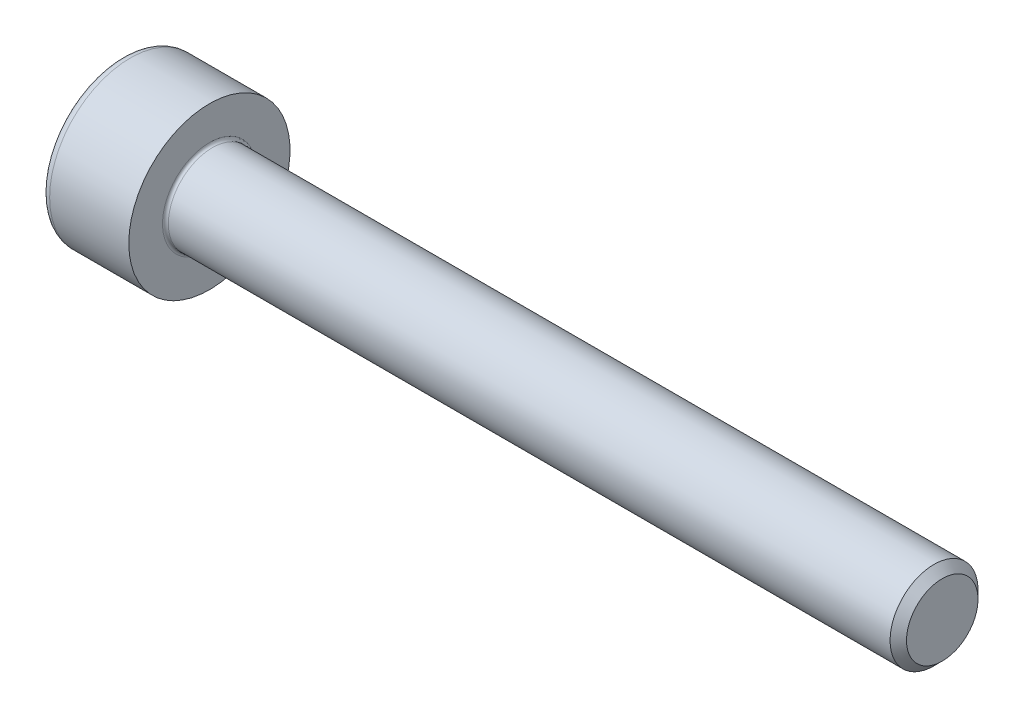
ISO-10303-21;
HEADER;
FILE_DESCRIPTION(('STEP AP214'),'2;1');
FILE_NAME('part.step','',(''),(''),'','','');
FILE_SCHEMA(('AUTOMOTIVE_DESIGN { 1 0 10303 214 1 1 1 1 }'));
ENDSEC;
DATA;
#1=APPLICATION_CONTEXT('core data for automotive mechanical design processes');
#2=APPLICATION_PROTOCOL_DEFINITION('international standard','automotive_design',2000,#1);
#3=PRODUCT_CONTEXT('',#1,'mechanical');
#4=PRODUCT('Part','Part','',(#3));
#5=PRODUCT_RELATED_PRODUCT_CATEGORY('part','',(#4));
#6=PRODUCT_DEFINITION_FORMATION('','',#4);
#7=PRODUCT_DEFINITION_CONTEXT('part definition',#1,'design');
#8=PRODUCT_DEFINITION('design','',#6,#7);
#9=PRODUCT_DEFINITION_SHAPE('','',#8);
#10=(LENGTH_UNIT() NAMED_UNIT(*) SI_UNIT(.MILLI.,.METRE.));
#11=(NAMED_UNIT(*) PLANE_ANGLE_UNIT() SI_UNIT($,.RADIAN.));
#12=(NAMED_UNIT(*) SI_UNIT($,.STERADIAN.) SOLID_ANGLE_UNIT());
#13=UNCERTAINTY_MEASURE_WITH_UNIT(LENGTH_MEASURE(1.E-05),#10,'distance_accuracy_value','');
#14=(GEOMETRIC_REPRESENTATION_CONTEXT(3) GLOBAL_UNCERTAINTY_ASSIGNED_CONTEXT((#13)) GLOBAL_UNIT_ASSIGNED_CONTEXT((#10,
#11,#12)) REPRESENTATION_CONTEXT('',''));
#15=CARTESIAN_POINT('',(0.,0.,0.));
#16=DIRECTION('',(0.,0.,1.));
#17=DIRECTION('',(1.,0.,0.));
#18=AXIS2_PLACEMENT_3D('',#15,#16,#17);
#19=CARTESIAN_POINT('',(0.,0.,0.));
#20=DIRECTION('',(-1.,0.,0.));
#21=DIRECTION('',(0.,0.,1.));
#22=AXIS2_PLACEMENT_3D('',#19,#20,#21);
#23=PLANE('',#22);
#24=DIRECTION('',(0.,-0.499999999999999,0.866025403784439));
#25=VECTOR('',#24,1.);
#26=CARTESIAN_POINT('',(0.,1.45492267835786,0.));
#27=LINE('',#26,#25);
#28=CARTESIAN_POINT('',(0.,1.45492267835786,0.));
#29=VERTEX_POINT('',#28);
#30=CARTESIAN_POINT('',(0.,0.72746133917893,1.26));
#31=VERTEX_POINT('',#30);
#32=EDGE_CURVE('E259',#29,#31,#27,.T.);
#33=ORIENTED_EDGE('',*,*,#32,.T.);
#34=DIRECTION('',(0.,1.,0.));
#35=VECTOR('',#34,1.);
#36=CARTESIAN_POINT('',(0.,-0.727461339178927,1.26));
#37=LINE('',#36,#35);
#38=CARTESIAN_POINT('',(0.,-0.727461339178927,1.26));
#39=VERTEX_POINT('',#38);
#40=EDGE_CURVE('E131',#39,#31,#37,.T.);
#41=ORIENTED_EDGE('',*,*,#40,.F.);
#42=DIRECTION('',(0.,-0.500000000000001,-0.866025403784438));
#43=VECTOR('',#42,1.);
#44=CARTESIAN_POINT('',(0.,-0.727461339178927,1.26));
#45=LINE('',#44,#43);
#46=CARTESIAN_POINT('',(0.,-1.45492267835786,0.));
#47=VERTEX_POINT('',#46);
#48=EDGE_CURVE('E262',#39,#47,#45,.T.);
#49=ORIENTED_EDGE('',*,*,#48,.T.);
#50=DIRECTION('',(0.,0.499999999999999,-0.866025403784439));
#51=VECTOR('',#50,1.);
#52=CARTESIAN_POINT('',(0.,-1.45492267835786,0.));
#53=LINE('',#52,#51);
#54=CARTESIAN_POINT('',(0.,-0.727461339178931,-1.26));
#55=VERTEX_POINT('',#54);
#56=EDGE_CURVE('E265',#47,#55,#53,.T.);
#57=ORIENTED_EDGE('',*,*,#56,.T.);
#58=DIRECTION('',(0.,-1.,0.));
#59=VECTOR('',#58,1.);
#60=CARTESIAN_POINT('',(0.,0.727461339178927,-1.26));
#61=LINE('',#60,#59);
#62=CARTESIAN_POINT('',(0.,0.727461339178927,-1.26));
#63=VERTEX_POINT('',#62);
#64=EDGE_CURVE('E268',#63,#55,#61,.T.);
#65=ORIENTED_EDGE('',*,*,#64,.F.);
#66=DIRECTION('',(0.,-0.500000000000001,-0.866025403784438));
#67=VECTOR('',#66,1.);
#68=CARTESIAN_POINT('',(0.,1.45492267835786,0.));
#69=LINE('',#68,#67);
#70=EDGE_CURVE('E126',#29,#63,#69,.T.);
#71=ORIENTED_EDGE('',*,*,#70,.F.);
#72=EDGE_LOOP('',(#33,#41,#49,#57,#65,#71));
#73=FACE_BOUND('',#72,.T.);
#74=CARTESIAN_POINT('',(0.,0.,0.));
#75=DIRECTION('',(-1.,0.,0.));
#76=DIRECTION('',(0.,0.,1.));
#77=AXIS2_PLACEMENT_3D('',#74,#75,#76);
#78=CIRCLE('',#77,2.45);
#79=CARTESIAN_POINT('',(0.,0.,2.45));
#80=VERTEX_POINT('',#79);
#81=EDGE_CURVE('E43',#80,#80,#78,.T.);
#82=ORIENTED_EDGE('',*,*,#81,.T.);
#83=EDGE_LOOP('',(#82));
#84=FACE_BOUND('',#83,.T.);
#85=ADVANCED_FACE('F35',(#73,#84),#23,.T.);
#86=CARTESIAN_POINT('',(-31.75,0.,0.));
#87=DIRECTION('',(-1.,0.,0.));
#88=DIRECTION('',(0.,0.,1.));
#89=AXIS2_PLACEMENT_3D('',#86,#87,#88);
#90=CYLINDRICAL_SURFACE('',#89,2.75);
#91=CARTESIAN_POINT('',(0.300000000000002,0.,0.));
#92=DIRECTION('',(-1.,0.,0.));
#93=DIRECTION('',(0.,0.,1.));
#94=AXIS2_PLACEMENT_3D('',#91,#92,#93);
#95=CIRCLE('',#94,2.75);
#96=CARTESIAN_POINT('',(0.300000000000002,0.,2.75));
#97=VERTEX_POINT('',#96);
#98=EDGE_CURVE('E11',#97,#97,#95,.F.);
#99=ORIENTED_EDGE('',*,*,#98,.T.);
#100=EDGE_LOOP('',(#99));
#101=FACE_BOUND('',#100,.T.);
#102=CARTESIAN_POINT('',(3.,0.,0.));
#103=DIRECTION('',(-1.,0.,0.));
#104=DIRECTION('',(0.,0.,1.));
#105=AXIS2_PLACEMENT_3D('',#102,#103,#104);
#106=CIRCLE('',#105,2.75);
#107=CARTESIAN_POINT('',(3.,0.,2.75));
#108=VERTEX_POINT('',#107);
#109=EDGE_CURVE('E149',#108,#108,#106,.T.);
#110=ORIENTED_EDGE('',*,*,#109,.T.);
#111=EDGE_LOOP('',(#110));
#112=FACE_BOUND('',#111,.T.);
#113=ADVANCED_FACE('F173',(#101,#112),#90,.T.);
#114=CARTESIAN_POINT('',(3.,2.75,0.));
#115=DIRECTION('',(1.,0.,0.));
#116=DIRECTION('',(0.,0.,-1.));
#117=AXIS2_PLACEMENT_3D('',#114,#115,#116);
#118=PLANE('',#117);
#119=CARTESIAN_POINT('',(3.,0.,0.));
#120=DIRECTION('',(1.,0.,0.));
#121=DIRECTION('',(0.,0.,-1.));
#122=AXIS2_PLACEMENT_3D('',#119,#120,#121);
#123=CIRCLE('',#122,1.59999999999999);
#124=CARTESIAN_POINT('',(3.,0.,-1.59999999999999));
#125=VERTEX_POINT('',#124);
#126=EDGE_CURVE('E152',#125,#125,#123,.F.);
#127=ORIENTED_EDGE('',*,*,#126,.T.);
#128=EDGE_LOOP('',(#127));
#129=FACE_BOUND('',#128,.T.);
#130=ORIENTED_EDGE('',*,*,#109,.F.);
#131=EDGE_LOOP('',(#130));
#132=FACE_BOUND('',#131,.T.);
#133=ADVANCED_FACE('F179',(#129,#132),#118,.T.);
#134=CARTESIAN_POINT('',(-31.75,0.,0.));
#135=DIRECTION('',(-1.,0.,0.));
#136=DIRECTION('',(0.,0.,1.));
#137=AXIS2_PLACEMENT_3D('',#134,#135,#136);
#138=CYLINDRICAL_SURFACE('',#137,1.49999999999999);
#139=CARTESIAN_POINT('',(3.1,0.,0.));
#140=DIRECTION('',(1.,0.,0.));
#141=DIRECTION('',(0.,0.,-1.));
#142=AXIS2_PLACEMENT_3D('',#139,#140,#141);
#143=CIRCLE('',#142,1.49999999999999);
#144=CARTESIAN_POINT('',(3.1,0.,-1.49999999999999));
#145=VERTEX_POINT('',#144);
#146=EDGE_CURVE('E155',#145,#145,#143,.T.);
#147=ORIENTED_EDGE('',*,*,#146,.T.);
#148=EDGE_LOOP('',(#147));
#149=FACE_BOUND('',#148,.T.);
#150=CARTESIAN_POINT('',(27.7195,0.,0.));
#151=DIRECTION('',(-1.,0.,0.));
#152=DIRECTION('',(0.,0.,1.));
#153=AXIS2_PLACEMENT_3D('',#150,#151,#152);
#154=CIRCLE('',#153,1.49999999999998);
#155=CARTESIAN_POINT('',(27.7195,0.,1.49999999999998));
#156=VERTEX_POINT('',#155);
#157=EDGE_CURVE('E146',#156,#156,#154,.T.);
#158=ORIENTED_EDGE('',*,*,#157,.T.);
#159=EDGE_LOOP('',(#158));
#160=FACE_BOUND('',#159,.T.);
#161=ADVANCED_FACE('F185',(#149,#160),#138,.T.);
#162=CARTESIAN_POINT('',(28.,0.,0.));
#163=DIRECTION('',(-1.,0.,0.));
#164=DIRECTION('',(0.,0.,1.));
#165=AXIS2_PLACEMENT_3D('',#162,#163,#164);
#166=CONICAL_SURFACE('',#165,1.2195,0.785398163397383);
#167=ORIENTED_EDGE('',*,*,#157,.F.);
#168=EDGE_LOOP('',(#167));
#169=FACE_BOUND('',#168,.T.);
#170=CARTESIAN_POINT('',(28.,0.,0.));
#171=DIRECTION('',(-1.,0.,0.));
#172=DIRECTION('',(0.,0.,1.));
#173=AXIS2_PLACEMENT_3D('',#170,#171,#172);
#174=CIRCLE('',#173,1.2195);
#175=CARTESIAN_POINT('',(28.,0.,1.2195));
#176=VERTEX_POINT('',#175);
#177=EDGE_CURVE('E142',#176,#176,#174,.T.);
#178=ORIENTED_EDGE('',*,*,#177,.T.);
#179=EDGE_LOOP('',(#178));
#180=FACE_BOUND('',#179,.T.);
#181=ADVANCED_FACE('F189',(#169,#180),#166,.T.);
#182=CARTESIAN_POINT('',(28.,1.2195,0.));
#183=DIRECTION('',(1.,0.,0.));
#184=DIRECTION('',(0.,0.,-1.));
#185=AXIS2_PLACEMENT_3D('',#182,#183,#184);
#186=PLANE('',#185);
#187=ORIENTED_EDGE('',*,*,#177,.F.);
#188=EDGE_LOOP('',(#187));
#189=FACE_BOUND('',#188,.T.);
#190=ADVANCED_FACE('F169',(#189),#186,.T.);
#191=CARTESIAN_POINT('',(3.1,0.,0.));
#192=DIRECTION('',(1.,0.,0.));
#193=DIRECTION('',(0.,0.,-1.));
#194=AXIS2_PLACEMENT_3D('',#191,#192,#193);
#195=TOROIDAL_SURFACE('',#194,1.59999999999999,0.1);
#196=ORIENTED_EDGE('',*,*,#146,.F.);
#197=EDGE_LOOP('',(#196));
#198=FACE_BOUND('',#197,.T.);
#199=ORIENTED_EDGE('',*,*,#126,.F.);
#200=EDGE_LOOP('',(#199));
#201=FACE_BOUND('',#200,.T.);
#202=ADVANCED_FACE('F162',(#198,#201),#195,.F.);
#203=CARTESIAN_POINT('',(0.300000000000002,0.,0.));
#204=DIRECTION('',(-1.,0.,0.));
#205=DIRECTION('',(0.,0.,1.));
#206=AXIS2_PLACEMENT_3D('',#203,#204,#205);
#207=TOROIDAL_SURFACE('',#206,2.45,0.3);
#208=ORIENTED_EDGE('',*,*,#98,.F.);
#209=EDGE_LOOP('',(#208));
#210=FACE_BOUND('',#209,.T.);
#211=ORIENTED_EDGE('',*,*,#81,.F.);
#212=EDGE_LOOP('',(#211));
#213=FACE_BOUND('',#212,.T.);
#214=ADVANCED_FACE('F37',(#210,#213),#207,.T.);
#215=CARTESIAN_POINT('',(1.3,1.45492267835786,0.));
#216=DIRECTION('',(0.,-0.866025403784439,-0.499999999999999));
#217=DIRECTION('',(0.,0.499999999999999,-0.866025403784439));
#218=AXIS2_PLACEMENT_3D('',#215,#216,#217);
#219=PLANE('',#218);
#220=ORIENTED_EDGE('',*,*,#32,.F.);
#221=DIRECTION('',(-1.,0.,0.));
#222=VECTOR('',#221,1.);
#223=CARTESIAN_POINT('',(1.3,1.45492267835786,0.));
#224=LINE('',#223,#222);
#225=CARTESIAN_POINT('',(1.3,1.45492267835786,0.));
#226=VERTEX_POINT('',#225);
#227=EDGE_CURVE('E249',#226,#29,#224,.T.);
#228=ORIENTED_EDGE('',*,*,#227,.F.);
#229=DIRECTION('',(0.,-0.499999999999999,0.866025403784439));
#230=VECTOR('',#229,1.);
#231=CARTESIAN_POINT('',(1.3,1.45492267835786,0.));
#232=LINE('',#231,#230);
#233=CARTESIAN_POINT('',(1.3,1.09119200876839,0.629999999999999));
#234=VERTEX_POINT('',#233);
#235=EDGE_CURVE('E118',#226,#234,#232,.T.);
#236=ORIENTED_EDGE('',*,*,#235,.T.);
#237=CARTESIAN_POINT('',(1.3,0.72746133917893,1.26));
#238=VERTEX_POINT('',#237);
#239=EDGE_CURVE('E109',#234,#238,#232,.T.);
#240=ORIENTED_EDGE('',*,*,#239,.T.);
#241=DIRECTION('',(-1.,0.,0.));
#242=VECTOR('',#241,1.);
#243=CARTESIAN_POINT('',(1.3,0.72746133917893,1.26));
#244=LINE('',#243,#242);
#245=EDGE_CURVE('E123',#238,#31,#244,.T.);
#246=ORIENTED_EDGE('',*,*,#245,.T.);
#247=EDGE_LOOP('',(#220,#228,#236,#240,#246));
#248=FACE_BOUND('',#247,.T.);
#249=ADVANCED_FACE('F122',(#248),#219,.T.);
#250=CARTESIAN_POINT('',(1.3,-0.727461339178927,1.26));
#251=DIRECTION('',(0.,0.,1.));
#252=DIRECTION('',(0.,-1.,0.));
#253=AXIS2_PLACEMENT_3D('',#250,#251,#252);
#254=PLANE('',#253);
#255=ORIENTED_EDGE('',*,*,#40,.T.);
#256=ORIENTED_EDGE('',*,*,#245,.F.);
#257=DIRECTION('',(0.,1.,0.));
#258=VECTOR('',#257,1.);
#259=CARTESIAN_POINT('',(1.3,-0.727461339178927,1.26));
#260=LINE('',#259,#258);
#261=CARTESIAN_POINT('',(1.3,0.,1.26));
#262=VERTEX_POINT('',#261);
#263=EDGE_CURVE('E106',#262,#238,#260,.T.);
#264=ORIENTED_EDGE('',*,*,#263,.F.);
#265=CARTESIAN_POINT('',(1.3,-0.727461339178927,1.26));
#266=VERTEX_POINT('',#265);
#267=EDGE_CURVE('E117',#266,#262,#260,.T.);
#268=ORIENTED_EDGE('',*,*,#267,.F.);
#269=DIRECTION('',(-1.,0.,0.));
#270=VECTOR('',#269,1.);
#271=CARTESIAN_POINT('',(1.3,-0.727461339178927,1.26));
#272=LINE('',#271,#270);
#273=EDGE_CURVE('E133',#266,#39,#272,.T.);
#274=ORIENTED_EDGE('',*,*,#273,.T.);
#275=EDGE_LOOP('',(#255,#256,#264,#268,#274));
#276=FACE_BOUND('',#275,.T.);
#277=ADVANCED_FACE('F128',(#276),#254,.F.);
#278=CARTESIAN_POINT('',(1.3,-0.727461339178927,1.26));
#279=DIRECTION('',(0.,0.866025403784438,-0.500000000000001));
#280=DIRECTION('',(0.,0.500000000000001,0.866025403784438));
#281=AXIS2_PLACEMENT_3D('',#278,#279,#280);
#282=PLANE('',#281);
#283=ORIENTED_EDGE('',*,*,#48,.F.);
#284=ORIENTED_EDGE('',*,*,#273,.F.);
#285=DIRECTION('',(0.,-0.500000000000001,-0.866025403784438));
#286=VECTOR('',#285,1.);
#287=CARTESIAN_POINT('',(1.3,-0.727461339178927,1.26));
#288=LINE('',#287,#286);
#289=CARTESIAN_POINT('',(1.3,-1.09119200876839,0.630000000000001));
#290=VERTEX_POINT('',#289);
#291=EDGE_CURVE('E288',#266,#290,#288,.T.);
#292=ORIENTED_EDGE('',*,*,#291,.T.);
#293=CARTESIAN_POINT('',(1.3,-1.45492267835786,0.));
#294=VERTEX_POINT('',#293);
#295=EDGE_CURVE('E277',#290,#294,#288,.T.);
#296=ORIENTED_EDGE('',*,*,#295,.T.);
#297=DIRECTION('',(-1.,0.,0.));
#298=VECTOR('',#297,1.);
#299=CARTESIAN_POINT('',(1.3,-1.45492267835786,0.));
#300=LINE('',#299,#298);
#301=EDGE_CURVE('E138',#294,#47,#300,.T.);
#302=ORIENTED_EDGE('',*,*,#301,.T.);
#303=EDGE_LOOP('',(#283,#284,#292,#296,#302));
#304=FACE_BOUND('',#303,.T.);
#305=ADVANCED_FACE('F203',(#304),#282,.T.);
#306=CARTESIAN_POINT('',(1.3,-1.45492267835786,0.));
#307=DIRECTION('',(0.,0.866025403784439,0.499999999999999));
#308=DIRECTION('',(0.,-0.499999999999999,0.866025403784439));
#309=AXIS2_PLACEMENT_3D('',#306,#307,#308);
#310=PLANE('',#309);
#311=ORIENTED_EDGE('',*,*,#56,.F.);
#312=ORIENTED_EDGE('',*,*,#301,.F.);
#313=DIRECTION('',(0.,0.499999999999999,-0.866025403784439));
#314=VECTOR('',#313,1.);
#315=CARTESIAN_POINT('',(1.3,-1.45492267835786,0.));
#316=LINE('',#315,#314);
#317=CARTESIAN_POINT('',(1.3,-1.09119200876839,-0.629999999999998));
#318=VERTEX_POINT('',#317);
#319=EDGE_CURVE('E255',#294,#318,#316,.T.);
#320=ORIENTED_EDGE('',*,*,#319,.T.);
#321=CARTESIAN_POINT('',(1.3,-0.727461339178931,-1.26));
#322=VERTEX_POINT('',#321);
#323=EDGE_CURVE('E287',#318,#322,#316,.T.);
#324=ORIENTED_EDGE('',*,*,#323,.T.);
#325=DIRECTION('',(-1.,0.,0.));
#326=VECTOR('',#325,1.);
#327=CARTESIAN_POINT('',(1.3,-0.727461339178931,-1.26));
#328=LINE('',#327,#326);
#329=EDGE_CURVE('E248',#322,#55,#328,.T.);
#330=ORIENTED_EDGE('',*,*,#329,.T.);
#331=EDGE_LOOP('',(#311,#312,#320,#324,#330));
#332=FACE_BOUND('',#331,.T.);
#333=ADVANCED_FACE('F206',(#332),#310,.T.);
#334=CARTESIAN_POINT('',(1.3,0.727461339178927,-1.26));
#335=DIRECTION('',(0.,0.,-1.));
#336=DIRECTION('',(0.,1.,0.));
#337=AXIS2_PLACEMENT_3D('',#334,#335,#336);
#338=PLANE('',#337);
#339=ORIENTED_EDGE('',*,*,#64,.T.);
#340=ORIENTED_EDGE('',*,*,#329,.F.);
#341=DIRECTION('',(0.,-1.,0.));
#342=VECTOR('',#341,1.);
#343=CARTESIAN_POINT('',(1.3,0.727461339178927,-1.26));
#344=LINE('',#343,#342);
#345=CARTESIAN_POINT('',(1.3,0.,-1.26));
#346=VERTEX_POINT('',#345);
#347=EDGE_CURVE('E252',#346,#322,#344,.T.);
#348=ORIENTED_EDGE('',*,*,#347,.F.);
#349=CARTESIAN_POINT('',(1.3,0.727461339178927,-1.26));
#350=VERTEX_POINT('',#349);
#351=EDGE_CURVE('E50',#350,#346,#344,.T.);
#352=ORIENTED_EDGE('',*,*,#351,.F.);
#353=DIRECTION('',(-1.,0.,0.));
#354=VECTOR('',#353,1.);
#355=CARTESIAN_POINT('',(1.3,0.727461339178927,-1.26));
#356=LINE('',#355,#354);
#357=EDGE_CURVE('E245',#350,#63,#356,.T.);
#358=ORIENTED_EDGE('',*,*,#357,.T.);
#359=EDGE_LOOP('',(#339,#340,#348,#352,#358));
#360=FACE_BOUND('',#359,.T.);
#361=ADVANCED_FACE('F210',(#360),#338,.F.);
#362=CARTESIAN_POINT('',(1.3,1.45492267835786,0.));
#363=DIRECTION('',(0.,0.866025403784438,-0.500000000000001));
#364=DIRECTION('',(0.,0.500000000000001,0.866025403784438));
#365=AXIS2_PLACEMENT_3D('',#362,#363,#364);
#366=PLANE('',#365);
#367=ORIENTED_EDGE('',*,*,#70,.T.);
#368=ORIENTED_EDGE('',*,*,#357,.F.);
#369=DIRECTION('',(0.,-0.500000000000001,-0.866025403784438));
#370=VECTOR('',#369,1.);
#371=CARTESIAN_POINT('',(1.3,1.45492267835786,0.));
#372=LINE('',#371,#370);
#373=CARTESIAN_POINT('',(1.3,1.09119200876839,-0.630000000000002));
#374=VERTEX_POINT('',#373);
#375=EDGE_CURVE('E235',#374,#350,#372,.T.);
#376=ORIENTED_EDGE('',*,*,#375,.F.);
#377=EDGE_CURVE('E241',#226,#374,#372,.T.);
#378=ORIENTED_EDGE('',*,*,#377,.F.);
#379=ORIENTED_EDGE('',*,*,#227,.T.);
#380=EDGE_LOOP('',(#367,#368,#376,#378,#379));
#381=FACE_BOUND('',#380,.T.);
#382=ADVANCED_FACE('F214',(#381),#366,.F.);
#383=CARTESIAN_POINT('',(1.3,1.45492267835786,0.));
#384=DIRECTION('',(1.,0.,0.));
#385=DIRECTION('',(0.,0.,-1.));
#386=AXIS2_PLACEMENT_3D('',#383,#384,#385);
#387=PLANE('',#386);
#388=ORIENTED_EDGE('',*,*,#347,.T.);
#389=ORIENTED_EDGE('',*,*,#323,.F.);
#390=CARTESIAN_POINT('',(1.3,0.,0.));
#391=DIRECTION('',(-1.,0.,0.));
#392=DIRECTION('',(0.,0.,1.));
#393=AXIS2_PLACEMENT_3D('',#390,#391,#392);
#394=CIRCLE('',#393,1.26);
#395=EDGE_CURVE('E283',#346,#318,#394,.T.);
#396=ORIENTED_EDGE('',*,*,#395,.F.);
#397=EDGE_LOOP('',(#388,#389,#396));
#398=FACE_BOUND('',#397,.T.);
#399=ADVANCED_FACE('F218',(#398),#387,.F.);
#400=ORIENTED_EDGE('',*,*,#319,.F.);
#401=ORIENTED_EDGE('',*,*,#295,.F.);
#402=EDGE_CURVE('E136',#318,#290,#394,.T.);
#403=ORIENTED_EDGE('',*,*,#402,.F.);
#404=EDGE_LOOP('',(#400,#401,#403));
#405=FACE_BOUND('',#404,.T.);
#406=ADVANCED_FACE('F221',(#405),#387,.F.);
#407=ORIENTED_EDGE('',*,*,#291,.F.);
#408=ORIENTED_EDGE('',*,*,#267,.T.);
#409=EDGE_CURVE('E132',#290,#262,#394,.T.);
#410=ORIENTED_EDGE('',*,*,#409,.F.);
#411=EDGE_LOOP('',(#407,#408,#410));
#412=FACE_BOUND('',#411,.T.);
#413=ADVANCED_FACE('F226',(#412),#387,.F.);
#414=ORIENTED_EDGE('',*,*,#263,.T.);
#415=ORIENTED_EDGE('',*,*,#239,.F.);
#416=EDGE_CURVE('E112',#262,#234,#394,.T.);
#417=ORIENTED_EDGE('',*,*,#416,.F.);
#418=EDGE_LOOP('',(#414,#415,#417));
#419=FACE_BOUND('',#418,.T.);
#420=ADVANCED_FACE('F108',(#419),#387,.F.);
#421=ORIENTED_EDGE('',*,*,#235,.F.);
#422=ORIENTED_EDGE('',*,*,#377,.T.);
#423=EDGE_CURVE('E143',#234,#374,#394,.T.);
#424=ORIENTED_EDGE('',*,*,#423,.F.);
#425=EDGE_LOOP('',(#421,#422,#424));
#426=FACE_BOUND('',#425,.T.);
#427=ADVANCED_FACE('F229',(#426),#387,.F.);
#428=ORIENTED_EDGE('',*,*,#375,.T.);
#429=ORIENTED_EDGE('',*,*,#351,.T.);
#430=EDGE_CURVE('E238',#374,#346,#394,.T.);
#431=ORIENTED_EDGE('',*,*,#430,.F.);
#432=EDGE_LOOP('',(#428,#429,#431));
#433=FACE_BOUND('',#432,.T.);
#434=ADVANCED_FACE('F199',(#433),#387,.F.);
#435=CARTESIAN_POINT('',(1.3,0.,0.));
#436=DIRECTION('',(-1.,0.,0.));
#437=DIRECTION('',(0.,0.,1.));
#438=AXIS2_PLACEMENT_3D('',#435,#436,#437);
#439=CONICAL_SURFACE('',#438,1.26,1.04719755119659);
#440=CARTESIAN_POINT('',(2.02746133917894,0.,0.));
#441=VERTEX_POINT('',#440);
#442=VERTEX_LOOP('',#441);
#443=FACE_BOUND('',#442,.T.);
#444=ORIENTED_EDGE('',*,*,#416,.T.);
#445=ORIENTED_EDGE('',*,*,#423,.T.);
#446=ORIENTED_EDGE('',*,*,#430,.T.);
#447=ORIENTED_EDGE('',*,*,#395,.T.);
#448=ORIENTED_EDGE('',*,*,#402,.T.);
#449=ORIENTED_EDGE('',*,*,#409,.T.);
#450=EDGE_LOOP('',(#444,#445,#446,#447,#448,#449));
#451=FACE_BOUND('',#450,.T.);
#452=ADVANCED_FACE('F197',(#443,#451),#439,.F.);
#453=CLOSED_SHELL('',(#85,#113,#133,#161,#181,#190,#202,#214,#249,#277,#305,#333,#361,#382,#399,
#406,#413,#420,#427,#434,#452));
#454=MANIFOLD_SOLID_BREP('B2',#453);
#455=ADVANCED_BREP_SHAPE_REPRESENTATION('',(#18,#454),#14);
#456=SHAPE_DEFINITION_REPRESENTATION(#9,#455);
ENDSEC;
END-ISO-10303-21;
